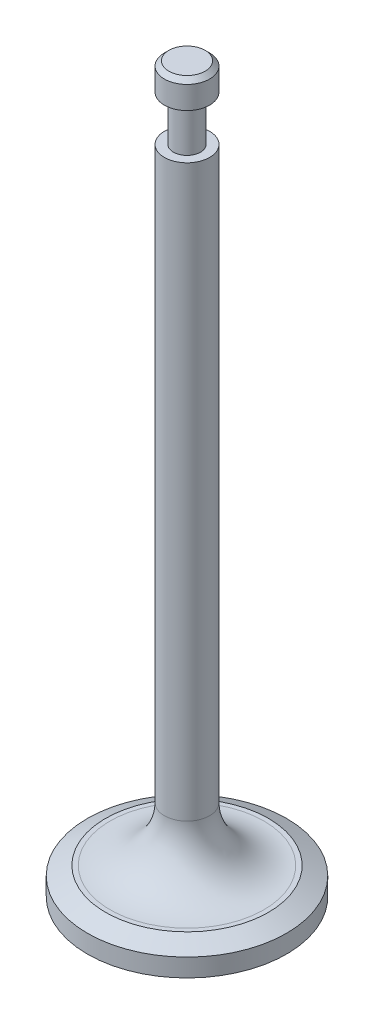
ISO-10303-21;
HEADER;
FILE_DESCRIPTION(('STEP AP214'),'2;1');
FILE_NAME('part.step','',(''),(''),'','','');
FILE_SCHEMA(('AUTOMOTIVE_DESIGN { 1 0 10303 214 1 1 1 1 }'));
ENDSEC;
DATA;
#1=APPLICATION_CONTEXT('core data for automotive mechanical design processes');
#2=APPLICATION_PROTOCOL_DEFINITION('international standard','automotive_design',2000,#1);
#3=PRODUCT_CONTEXT('',#1,'mechanical');
#4=PRODUCT('Part','Part','',(#3));
#5=PRODUCT_RELATED_PRODUCT_CATEGORY('part','',(#4));
#6=PRODUCT_DEFINITION_FORMATION('','',#4);
#7=PRODUCT_DEFINITION_CONTEXT('part definition',#1,'design');
#8=PRODUCT_DEFINITION('design','',#6,#7);
#9=PRODUCT_DEFINITION_SHAPE('','',#8);
#10=(LENGTH_UNIT() NAMED_UNIT(*) SI_UNIT(.MILLI.,.METRE.));
#11=(NAMED_UNIT(*) PLANE_ANGLE_UNIT() SI_UNIT($,.RADIAN.));
#12=(NAMED_UNIT(*) SI_UNIT($,.STERADIAN.) SOLID_ANGLE_UNIT());
#13=UNCERTAINTY_MEASURE_WITH_UNIT(LENGTH_MEASURE(1.E-05),#10,'distance_accuracy_value','');
#14=(GEOMETRIC_REPRESENTATION_CONTEXT(3) GLOBAL_UNCERTAINTY_ASSIGNED_CONTEXT((#13)) GLOBAL_UNIT_ASSIGNED_CONTEXT((#10,
#11,#12)) REPRESENTATION_CONTEXT('',''));
#15=CARTESIAN_POINT('',(0.,0.,0.));
#16=DIRECTION('',(0.,0.,1.));
#17=DIRECTION('',(1.,0.,0.));
#18=AXIS2_PLACEMENT_3D('',#15,#16,#17);
#19=CARTESIAN_POINT('',(0.,0.,-2.50000000000001));
#20=DIRECTION('',(0.,-1.,0.));
#21=DIRECTION('',(0.,0.,-1.));
#22=AXIS2_PLACEMENT_3D('',#19,#20,#21);
#23=PLANE('',#22);
#24=CARTESIAN_POINT('',(0.,0.,0.));
#25=DIRECTION('',(0.,-1.,0.));
#26=DIRECTION('',(0.,0.,-1.));
#27=AXIS2_PLACEMENT_3D('',#24,#25,#26);
#28=CIRCLE('',#27,2.00000000000003);
#29=CARTESIAN_POINT('',(0.,0.,-2.00000000000003));
#30=VERTEX_POINT('',#29);
#31=EDGE_CURVE('E41',#30,#30,#28,.F.);
#32=ORIENTED_EDGE('',*,*,#31,.T.);
#33=EDGE_LOOP('',(#32));
#34=FACE_BOUND('',#33,.T.);
#35=ADVANCED_FACE('F33',(#34),#23,.F.);
#36=CARTESIAN_POINT('',(0.,-80.,0.));
#37=DIRECTION('',(0.,1.,0.));
#38=DIRECTION('',(0.,0.,1.));
#39=AXIS2_PLACEMENT_3D('',#36,#37,#38);
#40=PLANE('',#39);
#41=CARTESIAN_POINT('',(0.,-80.,0.));
#42=DIRECTION('',(0.,1.,0.));
#43=DIRECTION('',(0.,0.,1.));
#44=AXIS2_PLACEMENT_3D('',#41,#42,#43);
#45=CIRCLE('',#44,11.);
#46=CARTESIAN_POINT('',(0.,-80.,11.));
#47=VERTEX_POINT('',#46);
#48=EDGE_CURVE('E60',#47,#47,#45,.T.);
#49=ORIENTED_EDGE('',*,*,#48,.F.);
#50=EDGE_LOOP('',(#49));
#51=FACE_BOUND('',#50,.T.);
#52=ADVANCED_FACE('F108',(#51),#40,.F.);
#53=CARTESIAN_POINT('',(0.,0.,0.));
#54=DIRECTION('',(0.,1.,0.));
#55=DIRECTION('',(0.,0.,1.));
#56=AXIS2_PLACEMENT_3D('',#53,#54,#55);
#57=CYLINDRICAL_SURFACE('',#56,11.);
#58=CARTESIAN_POINT('',(0.,-78.,0.));
#59=DIRECTION('',(0.,-1.,0.));
#60=DIRECTION('',(0.,0.,-1.));
#61=AXIS2_PLACEMENT_3D('',#58,#59,#60);
#62=CIRCLE('',#61,11.);
#63=CARTESIAN_POINT('',(0.,-78.,-11.));
#64=VERTEX_POINT('',#63);
#65=EDGE_CURVE('E45',#64,#64,#62,.T.);
#66=ORIENTED_EDGE('',*,*,#65,.T.);
#67=EDGE_LOOP('',(#66));
#68=FACE_BOUND('',#67,.T.);
#69=ORIENTED_EDGE('',*,*,#48,.T.);
#70=EDGE_LOOP('',(#69));
#71=FACE_BOUND('',#70,.T.);
#72=ADVANCED_FACE('F104',(#68,#71),#57,.T.);
#73=CARTESIAN_POINT('',(0.,-77.,-11.));
#74=DIRECTION('',(0.,-1.,0.));
#75=DIRECTION('',(0.,0.,-1.));
#76=AXIS2_PLACEMENT_3D('',#73,#74,#75);
#77=PLANE('',#76);
#78=CARTESIAN_POINT('',(0.,-77.,0.));
#79=DIRECTION('',(0.,-1.,0.));
#80=DIRECTION('',(0.,0.,-1.));
#81=AXIS2_PLACEMENT_3D('',#78,#79,#80);
#82=CIRCLE('',#81,8.99999999999996);
#83=CARTESIAN_POINT('',(0.,-77.,-8.99999999999997));
#84=VERTEX_POINT('',#83);
#85=EDGE_CURVE('E49',#84,#84,#82,.F.);
#86=ORIENTED_EDGE('',*,*,#85,.T.);
#87=EDGE_LOOP('',(#86));
#88=FACE_BOUND('',#87,.T.);
#89=CARTESIAN_POINT('',(0.,-77.,0.));
#90=DIRECTION('',(0.,-1.,0.));
#91=DIRECTION('',(0.,0.,-1.));
#92=AXIS2_PLACEMENT_3D('',#89,#90,#91);
#93=CIRCLE('',#92,8.5);
#94=CARTESIAN_POINT('',(0.,-77.,-8.50000000000001));
#95=VERTEX_POINT('',#94);
#96=EDGE_CURVE('E54',#95,#95,#93,.T.);
#97=ORIENTED_EDGE('',*,*,#96,.T.);
#98=EDGE_LOOP('',(#97));
#99=FACE_BOUND('',#98,.T.);
#100=ADVANCED_FACE('F98',(#88,#99),#77,.F.);
#101=CARTESIAN_POINT('',(0.,0.,0.));
#102=DIRECTION('',(0.,1.,0.));
#103=DIRECTION('',(0.,0.,1.));
#104=AXIS2_PLACEMENT_3D('',#101,#102,#103);
#105=CYLINDRICAL_SURFACE('',#104,2.5);
#106=CARTESIAN_POINT('',(0.,-71.,0.));
#107=DIRECTION('',(0.,-1.,0.));
#108=DIRECTION('',(0.,0.,-1.));
#109=AXIS2_PLACEMENT_3D('',#106,#107,#108);
#110=CIRCLE('',#109,2.5);
#111=CARTESIAN_POINT('',(0.,-71.,-2.50000000000001));
#112=VERTEX_POINT('',#111);
#113=EDGE_CURVE('E57',#112,#112,#110,.F.);
#114=ORIENTED_EDGE('',*,*,#113,.T.);
#115=EDGE_LOOP('',(#114));
#116=FACE_BOUND('',#115,.T.);
#117=CARTESIAN_POINT('',(0.,-8.,0.));
#118=DIRECTION('',(0.,1.,0.));
#119=DIRECTION('',(0.,0.,1.));
#120=AXIS2_PLACEMENT_3D('',#117,#118,#119);
#121=CIRCLE('',#120,2.50000000000001);
#122=CARTESIAN_POINT('',(0.,-8.,2.50000000000001));
#123=VERTEX_POINT('',#122);
#124=EDGE_CURVE('E63',#123,#123,#121,.T.);
#125=ORIENTED_EDGE('',*,*,#124,.F.);
#126=EDGE_LOOP('',(#125));
#127=FACE_BOUND('',#126,.T.);
#128=ADVANCED_FACE('F93',(#116,#127),#105,.T.);
#129=CARTESIAN_POINT('',(0.,-8.,-2.50000000000001));
#130=DIRECTION('',(0.,-1.,0.));
#131=DIRECTION('',(0.,0.,-1.));
#132=AXIS2_PLACEMENT_3D('',#129,#130,#131);
#133=PLANE('',#132);
#134=CARTESIAN_POINT('',(0.,-8.,0.));
#135=DIRECTION('',(0.,1.,0.));
#136=DIRECTION('',(0.,0.,1.));
#137=AXIS2_PLACEMENT_3D('',#134,#135,#136);
#138=CIRCLE('',#137,1.50000000000001);
#139=CARTESIAN_POINT('',(0.,-8.,1.50000000000001));
#140=VERTEX_POINT('',#139);
#141=EDGE_CURVE('E66',#140,#140,#138,.T.);
#142=ORIENTED_EDGE('',*,*,#141,.F.);
#143=EDGE_LOOP('',(#142));
#144=FACE_BOUND('',#143,.T.);
#145=ORIENTED_EDGE('',*,*,#124,.T.);
#146=EDGE_LOOP('',(#145));
#147=FACE_BOUND('',#146,.T.);
#148=ADVANCED_FACE('F87',(#144,#147),#133,.F.);
#149=CARTESIAN_POINT('',(0.,0.,0.));
#150=DIRECTION('',(0.,1.,0.));
#151=DIRECTION('',(0.,0.,1.));
#152=AXIS2_PLACEMENT_3D('',#149,#150,#151);
#153=CYLINDRICAL_SURFACE('',#152,1.50000000000001);
#154=CARTESIAN_POINT('',(0.,-3.,0.));
#155=DIRECTION('',(0.,1.,0.));
#156=DIRECTION('',(0.,0.,1.));
#157=AXIS2_PLACEMENT_3D('',#154,#155,#156);
#158=CIRCLE('',#157,1.50000000000001);
#159=CARTESIAN_POINT('',(0.,-3.,1.50000000000001));
#160=VERTEX_POINT('',#159);
#161=EDGE_CURVE('E69',#160,#160,#158,.T.);
#162=ORIENTED_EDGE('',*,*,#161,.F.);
#163=EDGE_LOOP('',(#162));
#164=FACE_BOUND('',#163,.T.);
#165=ORIENTED_EDGE('',*,*,#141,.T.);
#166=EDGE_LOOP('',(#165));
#167=FACE_BOUND('',#166,.T.);
#168=ADVANCED_FACE('F81',(#164,#167),#153,.T.);
#169=CARTESIAN_POINT('',(0.,-3.,-1.50000000000001));
#170=DIRECTION('',(0.,1.,0.));
#171=DIRECTION('',(0.,0.,1.));
#172=AXIS2_PLACEMENT_3D('',#169,#170,#171);
#173=PLANE('',#172);
#174=CARTESIAN_POINT('',(0.,-3.,0.));
#175=DIRECTION('',(0.,1.,0.));
#176=DIRECTION('',(0.,0.,1.));
#177=AXIS2_PLACEMENT_3D('',#174,#175,#176);
#178=CIRCLE('',#177,2.50000000000001);
#179=CARTESIAN_POINT('',(0.,-3.,2.50000000000001));
#180=VERTEX_POINT('',#179);
#181=EDGE_CURVE('E72',#180,#180,#178,.T.);
#182=ORIENTED_EDGE('',*,*,#181,.F.);
#183=EDGE_LOOP('',(#182));
#184=FACE_BOUND('',#183,.T.);
#185=ORIENTED_EDGE('',*,*,#161,.T.);
#186=EDGE_LOOP('',(#185));
#187=FACE_BOUND('',#186,.T.);
#188=ADVANCED_FACE('F78',(#184,#187),#173,.F.);
#189=CARTESIAN_POINT('',(0.,0.,0.));
#190=DIRECTION('',(0.,1.,0.));
#191=DIRECTION('',(0.,0.,1.));
#192=AXIS2_PLACEMENT_3D('',#189,#190,#191);
#193=CYLINDRICAL_SURFACE('',#192,2.50000000000001);
#194=CARTESIAN_POINT('',(0.,-0.499999999999978,0.));
#195=DIRECTION('',(0.,-1.,0.));
#196=DIRECTION('',(0.,0.,-1.));
#197=AXIS2_PLACEMENT_3D('',#194,#195,#196);
#198=CIRCLE('',#197,2.50000000000001);
#199=CARTESIAN_POINT('',(0.,-0.499999999999978,-2.50000000000001));
#200=VERTEX_POINT('',#199);
#201=EDGE_CURVE('E10',#200,#200,#198,.T.);
#202=ORIENTED_EDGE('',*,*,#201,.T.);
#203=EDGE_LOOP('',(#202));
#204=FACE_BOUND('',#203,.T.);
#205=ORIENTED_EDGE('',*,*,#181,.T.);
#206=EDGE_LOOP('',(#205));
#207=FACE_BOUND('',#206,.T.);
#208=ADVANCED_FACE('F76',(#204,#207),#193,.T.);
#209=CARTESIAN_POINT('',(0.,-71.,0.));
#210=DIRECTION('',(0.,-1.,0.));
#211=DIRECTION('',(0.,0.,-1.));
#212=AXIS2_PLACEMENT_3D('',#209,#210,#211);
#213=TOROIDAL_SURFACE('',#212,8.5,6.);
#214=ORIENTED_EDGE('',*,*,#96,.F.);
#215=EDGE_LOOP('',(#214));
#216=FACE_BOUND('',#215,.T.);
#217=ORIENTED_EDGE('',*,*,#113,.F.);
#218=EDGE_LOOP('',(#217));
#219=FACE_BOUND('',#218,.T.);
#220=ADVANCED_FACE('F117',(#216,#219),#213,.F.);
#221=CARTESIAN_POINT('',(0.,-77.,0.));
#222=DIRECTION('',(0.,-1.,0.));
#223=DIRECTION('',(0.,0.,-1.));
#224=AXIS2_PLACEMENT_3D('',#221,#222,#223);
#225=CONICAL_SURFACE('',#224,8.99999999999995,1.10714871779409);
#226=ORIENTED_EDGE('',*,*,#65,.F.);
#227=EDGE_LOOP('',(#226));
#228=FACE_BOUND('',#227,.T.);
#229=ORIENTED_EDGE('',*,*,#85,.F.);
#230=EDGE_LOOP('',(#229));
#231=FACE_BOUND('',#230,.T.);
#232=ADVANCED_FACE('F119',(#228,#231),#225,.T.);
#233=CARTESIAN_POINT('',(0.,0.,0.));
#234=DIRECTION('',(0.,-1.,0.));
#235=DIRECTION('',(0.,0.,-1.));
#236=AXIS2_PLACEMENT_3D('',#233,#234,#235);
#237=CONICAL_SURFACE('',#236,2.00000000000003,0.785398163397453);
#238=ORIENTED_EDGE('',*,*,#201,.F.);
#239=EDGE_LOOP('',(#238));
#240=FACE_BOUND('',#239,.T.);
#241=ORIENTED_EDGE('',*,*,#31,.F.);
#242=EDGE_LOOP('',(#241));
#243=FACE_BOUND('',#242,.T.);
#244=ADVANCED_FACE('F36',(#240,#243),#237,.T.);
#245=CLOSED_SHELL('',(#35,#52,#72,#100,#128,#148,#168,#188,#208,#220,#232,#244));
#246=MANIFOLD_SOLID_BREP('B2',#245);
#247=ADVANCED_BREP_SHAPE_REPRESENTATION('',(#18,#246),#14);
#248=SHAPE_DEFINITION_REPRESENTATION(#9,#247);
ENDSEC;
END-ISO-10303-21;
